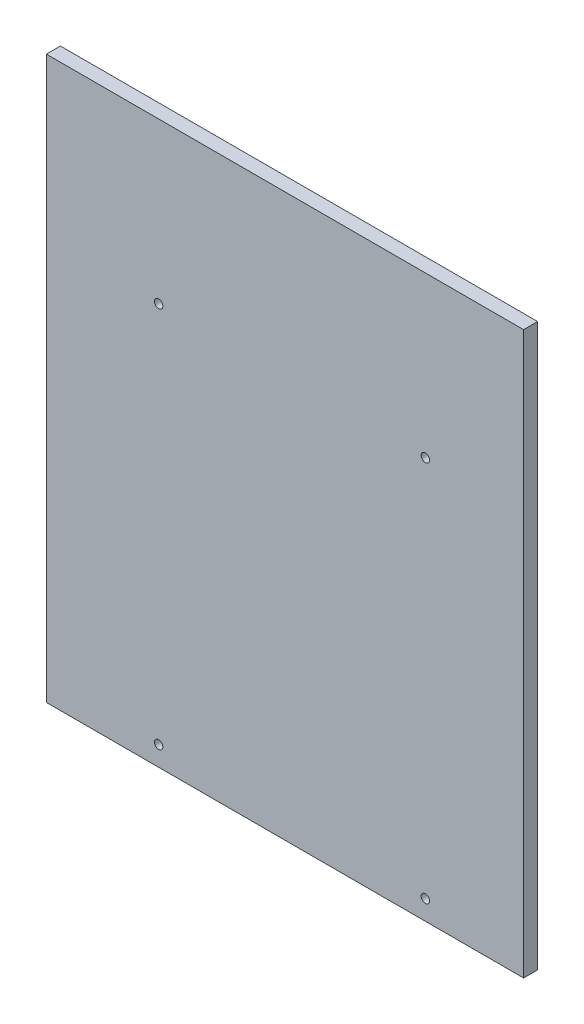
ISO-10303-21;
HEADER;
FILE_DESCRIPTION(('STEP AP214'),'2;1');
FILE_NAME('part.step','',(''),(''),'','','');
FILE_SCHEMA(('AUTOMOTIVE_DESIGN { 1 0 10303 214 1 1 1 1 }'));
ENDSEC;
DATA;
#1=APPLICATION_CONTEXT('core data for automotive mechanical design processes');
#2=APPLICATION_PROTOCOL_DEFINITION('international standard','automotive_design',2000,#1);
#3=PRODUCT_CONTEXT('',#1,'mechanical');
#4=PRODUCT('Part','Part','',(#3));
#5=PRODUCT_RELATED_PRODUCT_CATEGORY('part','',(#4));
#6=PRODUCT_DEFINITION_FORMATION('','',#4);
#7=PRODUCT_DEFINITION_CONTEXT('part definition',#1,'design');
#8=PRODUCT_DEFINITION('design','',#6,#7);
#9=PRODUCT_DEFINITION_SHAPE('','',#8);
#10=(LENGTH_UNIT() NAMED_UNIT(*) SI_UNIT(.MILLI.,.METRE.));
#11=(NAMED_UNIT(*) PLANE_ANGLE_UNIT() SI_UNIT($,.RADIAN.));
#12=(NAMED_UNIT(*) SI_UNIT($,.STERADIAN.) SOLID_ANGLE_UNIT());
#13=UNCERTAINTY_MEASURE_WITH_UNIT(LENGTH_MEASURE(1.E-05),#10,'distance_accuracy_value','');
#14=(GEOMETRIC_REPRESENTATION_CONTEXT(3) GLOBAL_UNCERTAINTY_ASSIGNED_CONTEXT((#13)) GLOBAL_UNIT_ASSIGNED_CONTEXT((#10,
#11,#12)) REPRESENTATION_CONTEXT('',''));
#15=CARTESIAN_POINT('',(0.,0.,0.));
#16=DIRECTION('',(0.,0.,1.));
#17=DIRECTION('',(1.,0.,0.));
#18=AXIS2_PLACEMENT_3D('',#15,#16,#17);
#19=CARTESIAN_POINT('',(0.,0.,5.));
#20=DIRECTION('',(0.,0.,-1.));
#21=DIRECTION('',(-1.,0.,0.));
#22=AXIS2_PLACEMENT_3D('',#19,#20,#21);
#23=PLANE('',#22);
#24=DIRECTION('',(0.,1.,0.));
#25=VECTOR('',#24,1.);
#26=CARTESIAN_POINT('',(85.,-100.,5.));
#27=LINE('',#26,#25);
#28=CARTESIAN_POINT('',(85.,-100.,5.));
#29=VERTEX_POINT('',#28);
#30=CARTESIAN_POINT('',(85.,100.,5.));
#31=VERTEX_POINT('',#30);
#32=EDGE_CURVE('E85',#29,#31,#27,.T.);
#33=ORIENTED_EDGE('',*,*,#32,.T.);
#34=DIRECTION('',(-1.,0.,0.));
#35=VECTOR('',#34,1.);
#36=CARTESIAN_POINT('',(-85.,100.,5.));
#37=LINE('',#36,#35);
#38=CARTESIAN_POINT('',(-85.,100.,5.));
#39=VERTEX_POINT('',#38);
#40=EDGE_CURVE('E80',#31,#39,#37,.T.);
#41=ORIENTED_EDGE('',*,*,#40,.T.);
#42=DIRECTION('',(0.,-1.,0.));
#43=VECTOR('',#42,1.);
#44=CARTESIAN_POINT('',(-85.,-100.,5.));
#45=LINE('',#44,#43);
#46=CARTESIAN_POINT('',(-85.,-100.,5.));
#47=VERTEX_POINT('',#46);
#48=EDGE_CURVE('E83',#39,#47,#45,.T.);
#49=ORIENTED_EDGE('',*,*,#48,.T.);
#50=DIRECTION('',(1.,0.,0.));
#51=VECTOR('',#50,1.);
#52=CARTESIAN_POINT('',(-85.,-100.,5.));
#53=LINE('',#52,#51);
#54=EDGE_CURVE('E50',#47,#29,#53,.T.);
#55=ORIENTED_EDGE('',*,*,#54,.T.);
#56=EDGE_LOOP('',(#33,#41,#49,#55));
#57=FACE_BOUND('',#56,.T.);
#58=CARTESIAN_POINT('',(-45.,43.,5.));
#59=DIRECTION('',(0.,0.,1.));
#60=DIRECTION('',(1.,0.,0.));
#61=AXIS2_PLACEMENT_3D('',#58,#59,#60);
#62=CIRCLE('',#61,1.5);
#63=CARTESIAN_POINT('',(-43.5,43.,5.));
#64=VERTEX_POINT('',#63);
#65=EDGE_CURVE('E100',#64,#64,#62,.T.);
#66=ORIENTED_EDGE('',*,*,#65,.F.);
#67=EDGE_LOOP('',(#66));
#68=FACE_BOUND('',#67,.T.);
#69=CARTESIAN_POINT('',(50.,43.,5.));
#70=DIRECTION('',(0.,0.,1.));
#71=DIRECTION('',(1.,0.,0.));
#72=AXIS2_PLACEMENT_3D('',#69,#70,#71);
#73=CIRCLE('',#72,1.5);
#74=CARTESIAN_POINT('',(51.5,43.,5.));
#75=VERTEX_POINT('',#74);
#76=EDGE_CURVE('E115',#75,#75,#73,.T.);
#77=ORIENTED_EDGE('',*,*,#76,.F.);
#78=EDGE_LOOP('',(#77));
#79=FACE_BOUND('',#78,.T.);
#80=CARTESIAN_POINT('',(50.,-93.,5.));
#81=DIRECTION('',(0.,0.,1.));
#82=DIRECTION('',(1.,0.,0.));
#83=AXIS2_PLACEMENT_3D('',#80,#81,#82);
#84=CIRCLE('',#83,1.5);
#85=CARTESIAN_POINT('',(51.5,-93.,5.));
#86=VERTEX_POINT('',#85);
#87=EDGE_CURVE('E121',#86,#86,#84,.T.);
#88=ORIENTED_EDGE('',*,*,#87,.F.);
#89=EDGE_LOOP('',(#88));
#90=FACE_BOUND('',#89,.T.);
#91=CARTESIAN_POINT('',(-45.,-93.,5.));
#92=DIRECTION('',(0.,0.,1.));
#93=DIRECTION('',(1.,0.,0.));
#94=AXIS2_PLACEMENT_3D('',#91,#92,#93);
#95=CIRCLE('',#94,1.5);
#96=CARTESIAN_POINT('',(-43.5,-93.,5.));
#97=VERTEX_POINT('',#96);
#98=EDGE_CURVE('E127',#97,#97,#95,.T.);
#99=ORIENTED_EDGE('',*,*,#98,.F.);
#100=EDGE_LOOP('',(#99));
#101=FACE_BOUND('',#100,.T.);
#102=ADVANCED_FACE('F33',(#57,#68,#79,#90,#101),#23,.F.);
#103=CARTESIAN_POINT('',(0.,0.,0.));
#104=DIRECTION('',(0.,0.,-1.));
#105=DIRECTION('',(-1.,0.,0.));
#106=AXIS2_PLACEMENT_3D('',#103,#104,#105);
#107=PLANE('',#106);
#108=CARTESIAN_POINT('',(50.,-93.,0.));
#109=DIRECTION('',(0.,0.,1.));
#110=DIRECTION('',(1.,0.,0.));
#111=AXIS2_PLACEMENT_3D('',#108,#109,#110);
#112=CIRCLE('',#111,1.5);
#113=CARTESIAN_POINT('',(51.5,-93.,0.));
#114=VERTEX_POINT('',#113);
#115=EDGE_CURVE('E124',#114,#114,#112,.T.);
#116=ORIENTED_EDGE('',*,*,#115,.T.);
#117=EDGE_LOOP('',(#116));
#118=FACE_BOUND('',#117,.T.);
#119=CARTESIAN_POINT('',(-45.,43.,0.));
#120=DIRECTION('',(0.,0.,1.));
#121=DIRECTION('',(1.,0.,0.));
#122=AXIS2_PLACEMENT_3D('',#119,#120,#121);
#123=CIRCLE('',#122,1.5);
#124=CARTESIAN_POINT('',(-43.5,43.,0.));
#125=VERTEX_POINT('',#124);
#126=EDGE_CURVE('E112',#125,#125,#123,.T.);
#127=ORIENTED_EDGE('',*,*,#126,.T.);
#128=EDGE_LOOP('',(#127));
#129=FACE_BOUND('',#128,.T.);
#130=DIRECTION('',(0.,1.,0.));
#131=VECTOR('',#130,1.);
#132=CARTESIAN_POINT('',(85.,-100.,0.));
#133=LINE('',#132,#131);
#134=CARTESIAN_POINT('',(85.,-100.,0.));
#135=VERTEX_POINT('',#134);
#136=CARTESIAN_POINT('',(85.,100.,0.));
#137=VERTEX_POINT('',#136);
#138=EDGE_CURVE('E97',#135,#137,#133,.T.);
#139=ORIENTED_EDGE('',*,*,#138,.F.);
#140=DIRECTION('',(1.,0.,0.));
#141=VECTOR('',#140,1.);
#142=CARTESIAN_POINT('',(-85.,-100.,0.));
#143=LINE('',#142,#141);
#144=CARTESIAN_POINT('',(-85.,-100.,0.));
#145=VERTEX_POINT('',#144);
#146=EDGE_CURVE('E73',#145,#135,#143,.T.);
#147=ORIENTED_EDGE('',*,*,#146,.F.);
#148=DIRECTION('',(0.,-1.,0.));
#149=VECTOR('',#148,1.);
#150=CARTESIAN_POINT('',(-85.,-100.,0.));
#151=LINE('',#150,#149);
#152=CARTESIAN_POINT('',(-85.,100.,0.));
#153=VERTEX_POINT('',#152);
#154=EDGE_CURVE('E67',#153,#145,#151,.T.);
#155=ORIENTED_EDGE('',*,*,#154,.F.);
#156=DIRECTION('',(-1.,0.,0.));
#157=VECTOR('',#156,1.);
#158=CARTESIAN_POINT('',(-85.,100.,0.));
#159=LINE('',#158,#157);
#160=EDGE_CURVE('E89',#137,#153,#159,.T.);
#161=ORIENTED_EDGE('',*,*,#160,.F.);
#162=EDGE_LOOP('',(#139,#147,#155,#161));
#163=FACE_BOUND('',#162,.T.);
#164=CARTESIAN_POINT('',(50.,43.,0.));
#165=DIRECTION('',(0.,0.,1.));
#166=DIRECTION('',(1.,0.,0.));
#167=AXIS2_PLACEMENT_3D('',#164,#165,#166);
#168=CIRCLE('',#167,1.5);
#169=CARTESIAN_POINT('',(51.5,43.,0.));
#170=VERTEX_POINT('',#169);
#171=EDGE_CURVE('E118',#170,#170,#168,.T.);
#172=ORIENTED_EDGE('',*,*,#171,.T.);
#173=EDGE_LOOP('',(#172));
#174=FACE_BOUND('',#173,.T.);
#175=CARTESIAN_POINT('',(-45.,-93.,0.));
#176=DIRECTION('',(0.,0.,1.));
#177=DIRECTION('',(1.,0.,0.));
#178=AXIS2_PLACEMENT_3D('',#175,#176,#177);
#179=CIRCLE('',#178,1.5);
#180=CARTESIAN_POINT('',(-43.5,-93.,0.));
#181=VERTEX_POINT('',#180);
#182=EDGE_CURVE('E130',#181,#181,#179,.T.);
#183=ORIENTED_EDGE('',*,*,#182,.T.);
#184=EDGE_LOOP('',(#183));
#185=FACE_BOUND('',#184,.T.);
#186=ADVANCED_FACE('F108',(#118,#129,#163,#174,#185),#107,.T.);
#187=CARTESIAN_POINT('',(85.,-100.,5.));
#188=DIRECTION('',(-1.,0.,0.));
#189=DIRECTION('',(0.,0.,1.));
#190=AXIS2_PLACEMENT_3D('',#187,#188,#189);
#191=PLANE('',#190);
#192=ORIENTED_EDGE('',*,*,#138,.T.);
#193=DIRECTION('',(0.,0.,-1.));
#194=VECTOR('',#193,1.);
#195=CARTESIAN_POINT('',(85.,100.,5.));
#196=LINE('',#195,#194);
#197=EDGE_CURVE('E11',#31,#137,#196,.T.);
#198=ORIENTED_EDGE('',*,*,#197,.F.);
#199=ORIENTED_EDGE('',*,*,#32,.F.);
#200=DIRECTION('',(0.,0.,-1.));
#201=VECTOR('',#200,1.);
#202=CARTESIAN_POINT('',(85.,-100.,5.));
#203=LINE('',#202,#201);
#204=EDGE_CURVE('E93',#29,#135,#203,.T.);
#205=ORIENTED_EDGE('',*,*,#204,.T.);
#206=EDGE_LOOP('',(#192,#198,#199,#205));
#207=FACE_BOUND('',#206,.T.);
#208=ADVANCED_FACE('F35',(#207),#191,.F.);
#209=CARTESIAN_POINT('',(-85.,100.,5.));
#210=DIRECTION('',(0.,-1.,0.));
#211=DIRECTION('',(0.,0.,-1.));
#212=AXIS2_PLACEMENT_3D('',#209,#210,#211);
#213=PLANE('',#212);
#214=ORIENTED_EDGE('',*,*,#160,.T.);
#215=DIRECTION('',(0.,0.,-1.));
#216=VECTOR('',#215,1.);
#217=CARTESIAN_POINT('',(-85.,100.,5.));
#218=LINE('',#217,#216);
#219=EDGE_CURVE('E42',#39,#153,#218,.T.);
#220=ORIENTED_EDGE('',*,*,#219,.F.);
#221=ORIENTED_EDGE('',*,*,#40,.F.);
#222=ORIENTED_EDGE('',*,*,#197,.T.);
#223=EDGE_LOOP('',(#214,#220,#221,#222));
#224=FACE_BOUND('',#223,.T.);
#225=ADVANCED_FACE('F88',(#224),#213,.F.);
#226=CARTESIAN_POINT('',(-85.,-100.,5.));
#227=DIRECTION('',(1.,0.,0.));
#228=DIRECTION('',(0.,0.,-1.));
#229=AXIS2_PLACEMENT_3D('',#226,#227,#228);
#230=PLANE('',#229);
#231=ORIENTED_EDGE('',*,*,#154,.T.);
#232=DIRECTION('',(0.,0.,-1.));
#233=VECTOR('',#232,1.);
#234=CARTESIAN_POINT('',(-85.,-100.,5.));
#235=LINE('',#234,#233);
#236=EDGE_CURVE('E90',#47,#145,#235,.T.);
#237=ORIENTED_EDGE('',*,*,#236,.F.);
#238=ORIENTED_EDGE('',*,*,#48,.F.);
#239=ORIENTED_EDGE('',*,*,#219,.T.);
#240=EDGE_LOOP('',(#231,#237,#238,#239));
#241=FACE_BOUND('',#240,.T.);
#242=ADVANCED_FACE('F91',(#241),#230,.F.);
#243=CARTESIAN_POINT('',(-85.,-100.,5.));
#244=DIRECTION('',(0.,1.,0.));
#245=DIRECTION('',(0.,0.,1.));
#246=AXIS2_PLACEMENT_3D('',#243,#244,#245);
#247=PLANE('',#246);
#248=ORIENTED_EDGE('',*,*,#146,.T.);
#249=ORIENTED_EDGE('',*,*,#204,.F.);
#250=ORIENTED_EDGE('',*,*,#54,.F.);
#251=ORIENTED_EDGE('',*,*,#236,.T.);
#252=EDGE_LOOP('',(#248,#249,#250,#251));
#253=FACE_BOUND('',#252,.T.);
#254=ADVANCED_FACE('F105',(#253),#247,.F.);
#255=CARTESIAN_POINT('',(-45.,43.,5.));
#256=DIRECTION('',(0.,0.,-1.));
#257=DIRECTION('',(-1.,0.,0.));
#258=AXIS2_PLACEMENT_3D('',#255,#256,#257);
#259=CYLINDRICAL_SURFACE('',#258,1.5);
#260=ORIENTED_EDGE('',*,*,#65,.T.);
#261=EDGE_LOOP('',(#260));
#262=FACE_BOUND('',#261,.T.);
#263=ORIENTED_EDGE('',*,*,#126,.F.);
#264=EDGE_LOOP('',(#263));
#265=FACE_BOUND('',#264,.T.);
#266=ADVANCED_FACE('F147',(#262,#265),#259,.F.);
#267=CARTESIAN_POINT('',(50.,43.,5.));
#268=DIRECTION('',(0.,0.,-1.));
#269=DIRECTION('',(-1.,0.,0.));
#270=AXIS2_PLACEMENT_3D('',#267,#268,#269);
#271=CYLINDRICAL_SURFACE('',#270,1.5);
#272=ORIENTED_EDGE('',*,*,#76,.T.);
#273=EDGE_LOOP('',(#272));
#274=FACE_BOUND('',#273,.T.);
#275=ORIENTED_EDGE('',*,*,#171,.F.);
#276=EDGE_LOOP('',(#275));
#277=FACE_BOUND('',#276,.T.);
#278=ADVANCED_FACE('F193',(#274,#277),#271,.F.);
#279=CARTESIAN_POINT('',(50.,-93.,5.));
#280=DIRECTION('',(0.,0.,-1.));
#281=DIRECTION('',(-1.,0.,0.));
#282=AXIS2_PLACEMENT_3D('',#279,#280,#281);
#283=CYLINDRICAL_SURFACE('',#282,1.5);
#284=ORIENTED_EDGE('',*,*,#87,.T.);
#285=EDGE_LOOP('',(#284));
#286=FACE_BOUND('',#285,.T.);
#287=ORIENTED_EDGE('',*,*,#115,.F.);
#288=EDGE_LOOP('',(#287));
#289=FACE_BOUND('',#288,.T.);
#290=ADVANCED_FACE('F201',(#286,#289),#283,.F.);
#291=CARTESIAN_POINT('',(-45.,-93.,5.));
#292=DIRECTION('',(0.,0.,-1.));
#293=DIRECTION('',(-1.,0.,0.));
#294=AXIS2_PLACEMENT_3D('',#291,#292,#293);
#295=CYLINDRICAL_SURFACE('',#294,1.5);
#296=ORIENTED_EDGE('',*,*,#98,.T.);
#297=EDGE_LOOP('',(#296));
#298=FACE_BOUND('',#297,.T.);
#299=ORIENTED_EDGE('',*,*,#182,.F.);
#300=EDGE_LOOP('',(#299));
#301=FACE_BOUND('',#300,.T.);
#302=ADVANCED_FACE('F136',(#298,#301),#295,.F.);
#303=CLOSED_SHELL('',(#102,#186,#208,#225,#242,#254,#266,#278,#290,#302));
#304=MANIFOLD_SOLID_BREP('B2',#303);
#305=ADVANCED_BREP_SHAPE_REPRESENTATION('',(#18,#304),#14);
#306=SHAPE_DEFINITION_REPRESENTATION(#9,#305);
ENDSEC;
END-ISO-10303-21;
